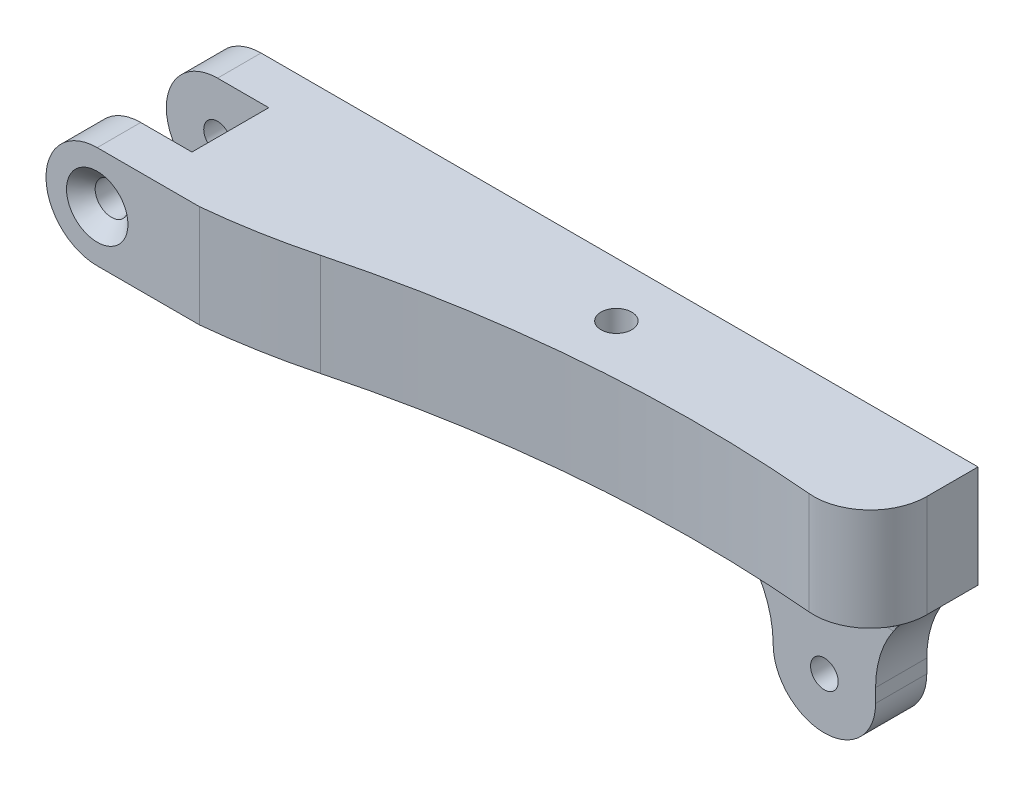
ISO-10303-21;
HEADER;
FILE_DESCRIPTION(('STEP AP214'),'2;1');
FILE_NAME('part.step','',(''),(''),'','','');
FILE_SCHEMA(('AUTOMOTIVE_DESIGN { 1 0 10303 214 1 1 1 1 }'));
ENDSEC;
DATA;
#1=APPLICATION_CONTEXT('core data for automotive mechanical design processes');
#2=APPLICATION_PROTOCOL_DEFINITION('international standard','automotive_design',2000,#1);
#3=PRODUCT_CONTEXT('',#1,'mechanical');
#4=PRODUCT('Part','Part','',(#3));
#5=PRODUCT_RELATED_PRODUCT_CATEGORY('part','',(#4));
#6=PRODUCT_DEFINITION_FORMATION('','',#4);
#7=PRODUCT_DEFINITION_CONTEXT('part definition',#1,'design');
#8=PRODUCT_DEFINITION('design','',#6,#7);
#9=PRODUCT_DEFINITION_SHAPE('','',#8);
#10=(LENGTH_UNIT() NAMED_UNIT(*) SI_UNIT(.MILLI.,.METRE.));
#11=(NAMED_UNIT(*) PLANE_ANGLE_UNIT() SI_UNIT($,.RADIAN.));
#12=(NAMED_UNIT(*) SI_UNIT($,.STERADIAN.) SOLID_ANGLE_UNIT());
#13=UNCERTAINTY_MEASURE_WITH_UNIT(LENGTH_MEASURE(1.E-05),#10,'distance_accuracy_value','');
#14=(GEOMETRIC_REPRESENTATION_CONTEXT(3) GLOBAL_UNCERTAINTY_ASSIGNED_CONTEXT((#13)) GLOBAL_UNIT_ASSIGNED_CONTEXT((#10,
#11,#12)) REPRESENTATION_CONTEXT('',''));
#15=CARTESIAN_POINT('',(0.,0.,0.));
#16=DIRECTION('',(0.,0.,1.));
#17=DIRECTION('',(1.,0.,0.));
#18=AXIS2_PLACEMENT_3D('',#15,#16,#17);
#19=CARTESIAN_POINT('',(0.,5.,16.));
#20=DIRECTION('',(0.,0.,-1.));
#21=DIRECTION('',(-1.,0.,0.));
#22=AXIS2_PLACEMENT_3D('',#19,#20,#21);
#23=CYLINDRICAL_SURFACE('',#22,1.6);
#24=CARTESIAN_POINT('',(0.,5.,11.75));
#25=DIRECTION('',(0.,0.,1.));
#26=DIRECTION('',(1.,0.,0.));
#27=AXIS2_PLACEMENT_3D('',#24,#25,#26);
#28=CIRCLE('',#27,1.6);
#29=CARTESIAN_POINT('',(1.6,5.,11.75));
#30=VERTEX_POINT('',#29);
#31=EDGE_CURVE('E270',#30,#30,#28,.T.);
#32=ORIENTED_EDGE('',*,*,#31,.F.);
#33=EDGE_LOOP('',(#32));
#34=FACE_BOUND('',#33,.T.);
#35=CARTESIAN_POINT('',(0.,5.,14.6));
#36=DIRECTION('',(0.,0.,1.));
#37=DIRECTION('',(1.,0.,0.));
#38=AXIS2_PLACEMENT_3D('',#35,#36,#37);
#39=CIRCLE('',#38,1.6);
#40=CARTESIAN_POINT('',(1.6,5.,14.6));
#41=VERTEX_POINT('',#40);
#42=EDGE_CURVE('E697',#41,#41,#39,.T.);
#43=ORIENTED_EDGE('',*,*,#42,.T.);
#44=EDGE_LOOP('',(#43));
#45=FACE_BOUND('',#44,.T.);
#46=ADVANCED_FACE('F42',(#34,#45),#23,.F.);
#47=CARTESIAN_POINT('',(0.,5.,16.));
#48=DIRECTION('',(0.,0.,-1.));
#49=DIRECTION('',(-1.,0.,0.));
#50=AXIS2_PLACEMENT_3D('',#47,#48,#49);
#51=CYLINDRICAL_SURFACE('',#50,5.);
#52=DIRECTION('',(0.,0.,-1.));
#53=VECTOR('',#52,1.);
#54=CARTESIAN_POINT('',(0.,10.,16.));
#55=LINE('',#54,#53);
#56=CARTESIAN_POINT('',(0.,10.,16.));
#57=VERTEX_POINT('',#56);
#58=CARTESIAN_POINT('',(0.,10.,11.75));
#59=VERTEX_POINT('',#58);
#60=EDGE_CURVE('E302',#57,#59,#55,.T.);
#61=ORIENTED_EDGE('',*,*,#60,.T.);
#62=CARTESIAN_POINT('',(0.,5.,11.75));
#63=DIRECTION('',(0.,0.,1.));
#64=DIRECTION('',(1.,0.,0.));
#65=AXIS2_PLACEMENT_3D('',#62,#63,#64);
#66=CIRCLE('',#65,5.);
#67=CARTESIAN_POINT('',(0.,0.,11.75));
#68=VERTEX_POINT('',#67);
#69=EDGE_CURVE('E271',#59,#68,#66,.T.);
#70=ORIENTED_EDGE('',*,*,#69,.T.);
#71=DIRECTION('',(0.,0.,-1.));
#72=VECTOR('',#71,1.);
#73=CARTESIAN_POINT('',(0.,0.,16.));
#74=LINE('',#73,#72);
#75=CARTESIAN_POINT('',(0.,0.,16.));
#76=VERTEX_POINT('',#75);
#77=EDGE_CURVE('E313',#76,#68,#74,.T.);
#78=ORIENTED_EDGE('',*,*,#77,.F.);
#79=CARTESIAN_POINT('',(0.,5.,16.));
#80=DIRECTION('',(0.,0.,1.));
#81=DIRECTION('',(1.,0.,0.));
#82=AXIS2_PLACEMENT_3D('',#79,#80,#81);
#83=CIRCLE('',#82,5.);
#84=EDGE_CURVE('E275',#57,#76,#83,.T.);
#85=ORIENTED_EDGE('',*,*,#84,.F.);
#86=EDGE_LOOP('',(#61,#70,#78,#85));
#87=FACE_BOUND('',#86,.T.);
#88=ADVANCED_FACE('F487',(#87),#51,.T.);
#89=CARTESIAN_POINT('',(0.,5.,16.));
#90=DIRECTION('',(0.,0.,1.));
#91=DIRECTION('',(1.,0.,0.));
#92=AXIS2_PLACEMENT_3D('',#89,#90,#91);
#93=PLANE('',#92);
#94=CARTESIAN_POINT('',(0.,5.,16.));
#95=DIRECTION('',(0.,0.,1.));
#96=DIRECTION('',(1.,0.,0.));
#97=AXIS2_PLACEMENT_3D('',#94,#95,#96);
#98=CIRCLE('',#97,3.);
#99=CARTESIAN_POINT('',(3.,5.,16.));
#100=VERTEX_POINT('',#99);
#101=EDGE_CURVE('E700',#100,#100,#98,.T.);
#102=ORIENTED_EDGE('',*,*,#101,.F.);
#103=EDGE_LOOP('',(#102));
#104=FACE_BOUND('',#103,.T.);
#105=DIRECTION('',(0.,1.,0.));
#106=VECTOR('',#105,1.);
#107=CARTESIAN_POINT('',(10.,0.,16.));
#108=LINE('',#107,#106);
#109=CARTESIAN_POINT('',(10.,0.,16.));
#110=VERTEX_POINT('',#109);
#111=CARTESIAN_POINT('',(10.,10.,16.));
#112=VERTEX_POINT('',#111);
#113=EDGE_CURVE('E215',#110,#112,#108,.T.);
#114=ORIENTED_EDGE('',*,*,#113,.T.);
#115=DIRECTION('',(-1.,0.,0.));
#116=VECTOR('',#115,1.);
#117=CARTESIAN_POINT('',(0.,10.,16.));
#118=LINE('',#117,#116);
#119=EDGE_CURVE('E284',#112,#57,#118,.T.);
#120=ORIENTED_EDGE('',*,*,#119,.T.);
#121=ORIENTED_EDGE('',*,*,#84,.T.);
#122=DIRECTION('',(1.,0.,0.));
#123=VECTOR('',#122,1.);
#124=CARTESIAN_POINT('',(0.,0.,16.));
#125=LINE('',#124,#123);
#126=EDGE_CURVE('E279',#76,#110,#125,.T.);
#127=ORIENTED_EDGE('',*,*,#126,.T.);
#128=EDGE_LOOP('',(#114,#120,#121,#127));
#129=FACE_BOUND('',#128,.T.);
#130=ADVANCED_FACE('F490',(#104,#129),#93,.T.);
#131=CARTESIAN_POINT('',(0.,5.,0.));
#132=DIRECTION('',(0.,0.,1.));
#133=DIRECTION('',(1.,0.,0.));
#134=AXIS2_PLACEMENT_3D('',#131,#132,#133);
#135=PLANE('',#134);
#136=CARTESIAN_POINT('',(60.,-9.99999999999999,0.));
#137=DIRECTION('',(0.,0.,1.));
#138=DIRECTION('',(1.,0.,0.));
#139=AXIS2_PLACEMENT_3D('',#136,#137,#138);
#140=CIRCLE('',#139,1.35);
#141=CARTESIAN_POINT('',(61.35,-9.99999999999999,0.));
#142=VERTEX_POINT('',#141);
#143=EDGE_CURVE('E206',#142,#142,#140,.T.);
#144=ORIENTED_EDGE('',*,*,#143,.T.);
#145=EDGE_LOOP('',(#144));
#146=FACE_BOUND('',#145,.T.);
#147=CARTESIAN_POINT('',(0.,5.,0.));
#148=DIRECTION('',(0.,0.,1.));
#149=DIRECTION('',(1.,0.,0.));
#150=AXIS2_PLACEMENT_3D('',#147,#148,#149);
#151=CIRCLE('',#150,5.);
#152=CARTESIAN_POINT('',(0.,10.,0.));
#153=VERTEX_POINT('',#152);
#154=CARTESIAN_POINT('',(0.,0.,0.));
#155=VERTEX_POINT('',#154);
#156=EDGE_CURVE('E274',#153,#155,#151,.T.);
#157=ORIENTED_EDGE('',*,*,#156,.F.);
#158=DIRECTION('',(-1.,0.,0.));
#159=VECTOR('',#158,1.);
#160=CARTESIAN_POINT('',(0.,10.,0.));
#161=LINE('',#160,#159);
#162=CARTESIAN_POINT('',(70.,10.,0.));
#163=VERTEX_POINT('',#162);
#164=EDGE_CURVE('E280',#163,#153,#161,.T.);
#165=ORIENTED_EDGE('',*,*,#164,.F.);
#166=DIRECTION('',(0.,1.,0.));
#167=VECTOR('',#166,1.);
#168=CARTESIAN_POINT('',(70.,0.,0.));
#169=LINE('',#168,#167);
#170=CARTESIAN_POINT('',(70.,0.,0.));
#171=VERTEX_POINT('',#170);
#172=EDGE_CURVE('E295',#171,#163,#169,.T.);
#173=ORIENTED_EDGE('',*,*,#172,.F.);
#174=CARTESIAN_POINT('',(75.,-8.66025403784439,0.));
#175=DIRECTION('',(0.,0.,1.));
#176=DIRECTION('',(1.,0.,0.));
#177=AXIS2_PLACEMENT_3D('',#174,#175,#176);
#178=CIRCLE('',#177,10.);
#179=CARTESIAN_POINT('',(65.,-8.66025403784439,0.));
#180=VERTEX_POINT('',#179);
#181=EDGE_CURVE('E332',#171,#180,#178,.T.);
#182=ORIENTED_EDGE('',*,*,#181,.T.);
#183=DIRECTION('',(0.,-1.,0.));
#184=VECTOR('',#183,1.);
#185=CARTESIAN_POINT('',(65.,-10.,0.));
#186=LINE('',#185,#184);
#187=CARTESIAN_POINT('',(65.,-10.,0.));
#188=VERTEX_POINT('',#187);
#189=EDGE_CURVE('E214',#180,#188,#186,.T.);
#190=ORIENTED_EDGE('',*,*,#189,.T.);
#191=CARTESIAN_POINT('',(60.,-9.99999999999999,0.));
#192=DIRECTION('',(0.,0.,-1.));
#193=DIRECTION('',(-1.,0.,0.));
#194=AXIS2_PLACEMENT_3D('',#191,#192,#193);
#195=CIRCLE('',#194,5.);
#196=CARTESIAN_POINT('',(55.,-9.99999999999999,0.));
#197=VERTEX_POINT('',#196);
#198=EDGE_CURVE('E225',#188,#197,#195,.T.);
#199=ORIENTED_EDGE('',*,*,#198,.T.);
#200=CARTESIAN_POINT('',(45.,-10.,0.));
#201=DIRECTION('',(0.,0.,1.));
#202=DIRECTION('',(1.,0.,0.));
#203=AXIS2_PLACEMENT_3D('',#200,#201,#202);
#204=CIRCLE('',#203,10.);
#205=CARTESIAN_POINT('',(45.,0.,0.));
#206=VERTEX_POINT('',#205);
#207=EDGE_CURVE('E348',#197,#206,#204,.T.);
#208=ORIENTED_EDGE('',*,*,#207,.T.);
#209=DIRECTION('',(1.,0.,0.));
#210=VECTOR('',#209,1.);
#211=CARTESIAN_POINT('',(0.,0.,0.));
#212=LINE('',#211,#210);
#213=EDGE_CURVE('E291',#155,#206,#212,.T.);
#214=ORIENTED_EDGE('',*,*,#213,.F.);
#215=EDGE_LOOP('',(#157,#165,#173,#182,#190,#199,#208,#214));
#216=FACE_BOUND('',#215,.T.);
#217=CARTESIAN_POINT('',(0.,5.,0.));
#218=DIRECTION('',(0.,0.,1.));
#219=DIRECTION('',(1.,0.,0.));
#220=AXIS2_PLACEMENT_3D('',#217,#218,#219);
#221=CIRCLE('',#220,1.35);
#222=CARTESIAN_POINT('',(1.35,5.,0.));
#223=VERTEX_POINT('',#222);
#224=EDGE_CURVE('E411',#223,#223,#221,.T.);
#225=ORIENTED_EDGE('',*,*,#224,.T.);
#226=EDGE_LOOP('',(#225));
#227=FACE_BOUND('',#226,.T.);
#228=ADVANCED_FACE('F425',(#146,#216,#227),#135,.F.);
#229=CARTESIAN_POINT('',(0.,5.,4.25));
#230=DIRECTION('',(0.,0.,-1.));
#231=DIRECTION('',(-1.,0.,0.));
#232=AXIS2_PLACEMENT_3D('',#229,#230,#231);
#233=CIRCLE('',#232,5.);
#234=CARTESIAN_POINT('',(0.,0.,4.25));
#235=VERTEX_POINT('',#234);
#236=CARTESIAN_POINT('',(0.,10.,4.25));
#237=VERTEX_POINT('',#236);
#238=EDGE_CURVE('E265',#235,#237,#233,.T.);
#239=ORIENTED_EDGE('',*,*,#238,.T.);
#240=EDGE_CURVE('E287',#237,#153,#55,.T.);
#241=ORIENTED_EDGE('',*,*,#240,.T.);
#242=ORIENTED_EDGE('',*,*,#156,.T.);
#243=EDGE_CURVE('E312',#235,#155,#74,.T.);
#244=ORIENTED_EDGE('',*,*,#243,.F.);
#245=EDGE_LOOP('',(#239,#241,#242,#244));
#246=FACE_BOUND('',#245,.T.);
#247=ADVANCED_FACE('F463',(#246),#51,.T.);
#248=CARTESIAN_POINT('',(0.,0.,16.));
#249=DIRECTION('',(0.,1.,0.));
#250=DIRECTION('',(0.,0.,1.));
#251=AXIS2_PLACEMENT_3D('',#248,#249,#250);
#252=PLANE('',#251);
#253=CARTESIAN_POINT('',(40.,0.,5.30992030128766));
#254=DIRECTION('',(0.,-1.,0.));
#255=DIRECTION('',(0.,0.,-1.));
#256=AXIS2_PLACEMENT_3D('',#253,#254,#255);
#257=CIRCLE('',#256,1.5);
#258=CARTESIAN_POINT('',(40.,0.,3.80992030128765));
#259=VERTEX_POINT('',#258);
#260=EDGE_CURVE('E704',#259,#259,#257,.T.);
#261=ORIENTED_EDGE('',*,*,#260,.F.);
#262=EDGE_LOOP('',(#261));
#263=FACE_BOUND('',#262,.T.);
#264=DIRECTION('',(0.,0.,-1.));
#265=VECTOR('',#264,1.);
#266=CARTESIAN_POINT('',(10.,0.,16.));
#267=LINE('',#266,#265);
#268=CARTESIAN_POINT('',(10.,0.,11.75));
#269=VERTEX_POINT('',#268);
#270=CARTESIAN_POINT('',(10.,0.,4.25));
#271=VERTEX_POINT('',#270);
#272=EDGE_CURVE('E380',#269,#271,#267,.T.);
#273=ORIENTED_EDGE('',*,*,#272,.T.);
#274=DIRECTION('',(-1.,0.,0.));
#275=VECTOR('',#274,1.);
#276=CARTESIAN_POINT('',(5.,0.,4.25));
#277=LINE('',#276,#275);
#278=EDGE_CURVE('E243',#271,#235,#277,.T.);
#279=ORIENTED_EDGE('',*,*,#278,.T.);
#280=ORIENTED_EDGE('',*,*,#243,.T.);
#281=ORIENTED_EDGE('',*,*,#213,.T.);
#282=DIRECTION('',(0.,0.,-1.));
#283=VECTOR('',#282,1.);
#284=CARTESIAN_POINT('',(45.,0.,16.));
#285=LINE('',#284,#283);
#286=CARTESIAN_POINT('',(45.,0.,8.));
#287=VERTEX_POINT('',#286);
#288=EDGE_CURVE('E325',#206,#287,#285,.F.);
#289=ORIENTED_EDGE('',*,*,#288,.T.);
#290=DIRECTION('',(1.,0.,0.));
#291=VECTOR('',#290,1.);
#292=CARTESIAN_POINT('',(65.,0.,8.));
#293=LINE('',#292,#291);
#294=CARTESIAN_POINT('',(69.1145597711353,0.,8.));
#295=VERTEX_POINT('',#294);
#296=EDGE_CURVE('E173',#287,#295,#293,.T.);
#297=ORIENTED_EDGE('',*,*,#296,.T.);
#298=CARTESIAN_POINT('',(64.4750621894396,0.,5.));
#299=DIRECTION('',(0.,-1.,0.));
#300=DIRECTION('',(0.,0.,-1.));
#301=AXIS2_PLACEMENT_3D('',#298,#299,#300);
#302=CIRCLE('',#301,5.52493781056044);
#303=CARTESIAN_POINT('',(63.9869057747983,0.,10.5033300033166));
#304=VERTEX_POINT('',#303);
#305=EDGE_CURVE('E165',#295,#304,#302,.T.);
#306=ORIENTED_EDGE('',*,*,#305,.T.);
#307=CARTESIAN_POINT('',(52.6158412781554,0.,138.697323848537));
#308=DIRECTION('',(0.,1.,0.));
#309=DIRECTION('',(0.,0.,1.));
#310=AXIS2_PLACEMENT_3D('',#307,#308,#309);
#311=CIRCLE('',#310,128.697323848537);
#312=CARTESIAN_POINT('',(20.,0.,14.2015084028226));
#313=VERTEX_POINT('',#312);
#314=EDGE_CURVE('E171',#304,#313,#311,.T.);
#315=ORIENTED_EDGE('',*,*,#314,.T.);
#316=CARTESIAN_POINT('',(3.53565069500815,0.,-48.6434930499183));
#317=DIRECTION('',(0.,-1.,0.));
#318=DIRECTION('',(0.,0.,1.));
#319=AXIS2_PLACEMENT_3D('',#316,#317,#318);
#320=CIRCLE('',#319,64.9659064866472);
#321=EDGE_CURVE('E192',#313,#110,#320,.T.);
#322=ORIENTED_EDGE('',*,*,#321,.T.);
#323=ORIENTED_EDGE('',*,*,#126,.F.);
#324=ORIENTED_EDGE('',*,*,#77,.T.);
#325=DIRECTION('',(1.,0.,0.));
#326=VECTOR('',#325,1.);
#327=CARTESIAN_POINT('',(5.,0.,11.75));
#328=LINE('',#327,#326);
#329=EDGE_CURVE('E247',#68,#269,#328,.T.);
#330=ORIENTED_EDGE('',*,*,#329,.T.);
#331=EDGE_LOOP('',(#273,#279,#280,#281,#289,#297,#306,#315,#322,#323,#324,#330));
#332=FACE_BOUND('',#331,.T.);
#333=ADVANCED_FACE('F168',(#263,#332),#252,.F.);
#334=CARTESIAN_POINT('',(70.,0.,16.));
#335=DIRECTION('',(-1.,0.,0.));
#336=DIRECTION('',(0.,0.,1.));
#337=AXIS2_PLACEMENT_3D('',#334,#335,#336);
#338=PLANE('',#337);
#339=DIRECTION('',(0.,0.,-1.));
#340=VECTOR('',#339,1.);
#341=CARTESIAN_POINT('',(70.,10.,16.));
#342=LINE('',#341,#340);
#343=CARTESIAN_POINT('',(70.,10.,5.));
#344=VERTEX_POINT('',#343);
#345=EDGE_CURVE('E306',#344,#163,#342,.T.);
#346=ORIENTED_EDGE('',*,*,#345,.F.);
#347=DIRECTION('',(0.,1.,0.));
#348=VECTOR('',#347,1.);
#349=CARTESIAN_POINT('',(70.,0.,5.));
#350=LINE('',#349,#348);
#351=CARTESIAN_POINT('',(70.,0.,5.));
#352=VERTEX_POINT('',#351);
#353=EDGE_CURVE('E211',#352,#344,#350,.T.);
#354=ORIENTED_EDGE('',*,*,#353,.F.);
#355=DIRECTION('',(0.,0.,-1.));
#356=VECTOR('',#355,1.);
#357=CARTESIAN_POINT('',(70.,0.,16.));
#358=LINE('',#357,#356);
#359=EDGE_CURVE('E309',#352,#171,#358,.T.);
#360=ORIENTED_EDGE('',*,*,#359,.T.);
#361=ORIENTED_EDGE('',*,*,#172,.T.);
#362=EDGE_LOOP('',(#346,#354,#360,#361));
#363=FACE_BOUND('',#362,.T.);
#364=ADVANCED_FACE('F519',(#363),#338,.F.);
#365=CARTESIAN_POINT('',(0.,10.,16.));
#366=DIRECTION('',(0.,-1.,0.));
#367=DIRECTION('',(0.,0.,-1.));
#368=AXIS2_PLACEMENT_3D('',#365,#366,#367);
#369=PLANE('',#368);
#370=CARTESIAN_POINT('',(40.,10.,5.30992030128766));
#371=DIRECTION('',(0.,-1.,0.));
#372=DIRECTION('',(0.,0.,-1.));
#373=AXIS2_PLACEMENT_3D('',#370,#371,#372);
#374=CIRCLE('',#373,1.5);
#375=CARTESIAN_POINT('',(40.,10.,3.80992030128765));
#376=VERTEX_POINT('',#375);
#377=EDGE_CURVE('E417',#376,#376,#374,.T.);
#378=ORIENTED_EDGE('',*,*,#377,.T.);
#379=EDGE_LOOP('',(#378));
#380=FACE_BOUND('',#379,.T.);
#381=CARTESIAN_POINT('',(52.6158412781554,10.,138.697323848537));
#382=DIRECTION('',(0.,1.,0.));
#383=DIRECTION('',(0.,0.,1.));
#384=AXIS2_PLACEMENT_3D('',#381,#382,#383);
#385=CIRCLE('',#384,128.697323848537);
#386=CARTESIAN_POINT('',(63.9869057747983,10.,10.5033300033166));
#387=VERTEX_POINT('',#386);
#388=CARTESIAN_POINT('',(20.,10.,14.2015084028226));
#389=VERTEX_POINT('',#388);
#390=EDGE_CURVE('E205',#387,#389,#385,.T.);
#391=ORIENTED_EDGE('',*,*,#390,.F.);
#392=CARTESIAN_POINT('',(64.4750621894396,10.,5.));
#393=DIRECTION('',(0.,-1.,0.));
#394=DIRECTION('',(0.,0.,-1.));
#395=AXIS2_PLACEMENT_3D('',#392,#393,#394);
#396=CIRCLE('',#395,5.52493781056044);
#397=EDGE_CURVE('E186',#344,#387,#396,.T.);
#398=ORIENTED_EDGE('',*,*,#397,.F.);
#399=ORIENTED_EDGE('',*,*,#345,.T.);
#400=ORIENTED_EDGE('',*,*,#164,.T.);
#401=ORIENTED_EDGE('',*,*,#240,.F.);
#402=DIRECTION('',(-1.,0.,0.));
#403=VECTOR('',#402,1.);
#404=CARTESIAN_POINT('',(5.,10.,4.25));
#405=LINE('',#404,#403);
#406=CARTESIAN_POINT('',(5.,10.,4.25));
#407=VERTEX_POINT('',#406);
#408=EDGE_CURVE('E255',#407,#237,#405,.T.);
#409=ORIENTED_EDGE('',*,*,#408,.F.);
#410=DIRECTION('',(0.,0.,-1.));
#411=VECTOR('',#410,1.);
#412=CARTESIAN_POINT('',(5.,10.,4.25));
#413=LINE('',#412,#411);
#414=CARTESIAN_POINT('',(5.,10.,11.75));
#415=VERTEX_POINT('',#414);
#416=EDGE_CURVE('E239',#415,#407,#413,.T.);
#417=ORIENTED_EDGE('',*,*,#416,.F.);
#418=DIRECTION('',(1.,0.,0.));
#419=VECTOR('',#418,1.);
#420=CARTESIAN_POINT('',(5.,10.,11.75));
#421=LINE('',#420,#419);
#422=EDGE_CURVE('E248',#59,#415,#421,.T.);
#423=ORIENTED_EDGE('',*,*,#422,.F.);
#424=ORIENTED_EDGE('',*,*,#60,.F.);
#425=ORIENTED_EDGE('',*,*,#119,.F.);
#426=CARTESIAN_POINT('',(3.53565069500815,10.,-48.6434930499183));
#427=DIRECTION('',(0.,-1.,0.));
#428=DIRECTION('',(0.,0.,1.));
#429=AXIS2_PLACEMENT_3D('',#426,#427,#428);
#430=CIRCLE('',#429,64.9659064866472);
#431=EDGE_CURVE('E180',#389,#112,#430,.T.);
#432=ORIENTED_EDGE('',*,*,#431,.F.);
#433=EDGE_LOOP('',(#391,#398,#399,#400,#401,#409,#417,#423,#424,#425,#432));
#434=FACE_BOUND('',#433,.T.);
#435=ADVANCED_FACE('F468',(#380,#434),#369,.F.);
#436=CARTESIAN_POINT('',(5.,0.,11.75));
#437=DIRECTION('',(0.,0.,1.));
#438=DIRECTION('',(1.,0.,0.));
#439=AXIS2_PLACEMENT_3D('',#436,#437,#438);
#440=PLANE('',#439);
#441=ORIENTED_EDGE('',*,*,#31,.T.);
#442=EDGE_LOOP('',(#441));
#443=FACE_BOUND('',#442,.T.);
#444=ORIENTED_EDGE('',*,*,#422,.T.);
#445=DIRECTION('',(0.,1.,0.));
#446=VECTOR('',#445,1.);
#447=CARTESIAN_POINT('',(5.,0.,11.75));
#448=LINE('',#447,#446);
#449=CARTESIAN_POINT('',(5.,5.00000000000002,11.75));
#450=VERTEX_POINT('',#449);
#451=EDGE_CURVE('E262',#450,#415,#448,.T.);
#452=ORIENTED_EDGE('',*,*,#451,.F.);
#453=DIRECTION('',(-0.707106781186546,0.707106781186549,0.));
#454=VECTOR('',#453,1.);
#455=CARTESIAN_POINT('',(7.50000000000001,2.5,11.75));
#456=LINE('',#455,#454);
#457=EDGE_CURVE('E11',#450,#269,#456,.F.);
#458=ORIENTED_EDGE('',*,*,#457,.T.);
#459=ORIENTED_EDGE('',*,*,#329,.F.);
#460=ORIENTED_EDGE('',*,*,#69,.F.);
#461=EDGE_LOOP('',(#444,#452,#458,#459,#460));
#462=FACE_BOUND('',#461,.T.);
#463=ADVANCED_FACE('F479',(#443,#462),#440,.F.);
#464=CARTESIAN_POINT('',(5.,0.,4.25));
#465=DIRECTION('',(0.,0.,-1.));
#466=DIRECTION('',(-1.,0.,0.));
#467=AXIS2_PLACEMENT_3D('',#464,#465,#466);
#468=PLANE('',#467);
#469=ORIENTED_EDGE('',*,*,#238,.F.);
#470=ORIENTED_EDGE('',*,*,#278,.F.);
#471=DIRECTION('',(0.707106781186546,-0.707106781186549,0.));
#472=VECTOR('',#471,1.);
#473=CARTESIAN_POINT('',(7.50000000000001,2.5,4.25));
#474=LINE('',#473,#472);
#475=CARTESIAN_POINT('',(5.,5.00000000000002,4.25));
#476=VERTEX_POINT('',#475);
#477=EDGE_CURVE('E52',#271,#476,#474,.F.);
#478=ORIENTED_EDGE('',*,*,#477,.T.);
#479=DIRECTION('',(0.,1.,0.));
#480=VECTOR('',#479,1.);
#481=CARTESIAN_POINT('',(5.,0.,4.25));
#482=LINE('',#481,#480);
#483=EDGE_CURVE('E251',#476,#407,#482,.T.);
#484=ORIENTED_EDGE('',*,*,#483,.T.);
#485=ORIENTED_EDGE('',*,*,#408,.T.);
#486=EDGE_LOOP('',(#469,#470,#478,#484,#485));
#487=FACE_BOUND('',#486,.T.);
#488=CARTESIAN_POINT('',(0.,5.,4.25));
#489=DIRECTION('',(0.,0.,-1.));
#490=DIRECTION('',(-1.,0.,0.));
#491=AXIS2_PLACEMENT_3D('',#488,#489,#490);
#492=CIRCLE('',#491,1.35);
#493=CARTESIAN_POINT('',(-1.35,5.,4.25));
#494=VERTEX_POINT('',#493);
#495=EDGE_CURVE('E404',#494,#494,#492,.T.);
#496=ORIENTED_EDGE('',*,*,#495,.T.);
#497=EDGE_LOOP('',(#496));
#498=FACE_BOUND('',#497,.T.);
#499=ADVANCED_FACE('F471',(#487,#498),#468,.F.);
#500=CARTESIAN_POINT('',(5.,0.,4.25));
#501=DIRECTION('',(1.,0.,0.));
#502=DIRECTION('',(0.,0.,-1.));
#503=AXIS2_PLACEMENT_3D('',#500,#501,#502);
#504=PLANE('',#503);
#505=ORIENTED_EDGE('',*,*,#483,.F.);
#506=DIRECTION('',(0.,0.,1.));
#507=VECTOR('',#506,1.);
#508=CARTESIAN_POINT('',(5.,5.00000000000002,4.25));
#509=LINE('',#508,#507);
#510=EDGE_CURVE('E59',#476,#450,#509,.T.);
#511=ORIENTED_EDGE('',*,*,#510,.T.);
#512=ORIENTED_EDGE('',*,*,#451,.T.);
#513=ORIENTED_EDGE('',*,*,#416,.T.);
#514=EDGE_LOOP('',(#505,#511,#512,#513));
#515=FACE_BOUND('',#514,.T.);
#516=ADVANCED_FACE('F482',(#515),#504,.F.);
#517=CARTESIAN_POINT('',(60.,-9.99999999999999,5.));
#518=DIRECTION('',(0.,0.,-1.));
#519=DIRECTION('',(-1.,0.,0.));
#520=AXIS2_PLACEMENT_3D('',#517,#518,#519);
#521=CYLINDRICAL_SURFACE('',#520,5.);
#522=ORIENTED_EDGE('',*,*,#198,.F.);
#523=DIRECTION('',(0.,0.,-1.));
#524=VECTOR('',#523,1.);
#525=CARTESIAN_POINT('',(65.,-10.,5.));
#526=LINE('',#525,#524);
#527=CARTESIAN_POINT('',(65.,-10.,5.));
#528=VERTEX_POINT('',#527);
#529=EDGE_CURVE('E229',#528,#188,#526,.T.);
#530=ORIENTED_EDGE('',*,*,#529,.F.);
#531=CARTESIAN_POINT('',(60.,-9.99999999999999,5.));
#532=DIRECTION('',(0.,0.,-1.));
#533=DIRECTION('',(-1.,0.,0.));
#534=AXIS2_PLACEMENT_3D('',#531,#532,#533);
#535=CIRCLE('',#534,5.);
#536=CARTESIAN_POINT('',(55.,-9.99999999999999,5.));
#537=VERTEX_POINT('',#536);
#538=EDGE_CURVE('E224',#528,#537,#535,.T.);
#539=ORIENTED_EDGE('',*,*,#538,.T.);
#540=DIRECTION('',(0.,0.,-1.));
#541=VECTOR('',#540,1.);
#542=CARTESIAN_POINT('',(55.,-9.99999999999999,5.));
#543=LINE('',#542,#541);
#544=EDGE_CURVE('E235',#537,#197,#543,.T.);
#545=ORIENTED_EDGE('',*,*,#544,.T.);
#546=EDGE_LOOP('',(#522,#530,#539,#545));
#547=FACE_BOUND('',#546,.T.);
#548=ADVANCED_FACE('F446',(#547),#521,.T.);
#549=CARTESIAN_POINT('',(65.,-10.,5.));
#550=DIRECTION('',(1.,0.,0.));
#551=DIRECTION('',(0.,0.,-1.));
#552=AXIS2_PLACEMENT_3D('',#549,#550,#551);
#553=PLANE('',#552);
#554=ORIENTED_EDGE('',*,*,#189,.F.);
#555=DIRECTION('',(0.,0.,-1.));
#556=VECTOR('',#555,1.);
#557=CARTESIAN_POINT('',(65.,-8.66025403784439,8.));
#558=LINE('',#557,#556);
#559=CARTESIAN_POINT('',(65.,-8.66025403784439,5.));
#560=VERTEX_POINT('',#559);
#561=EDGE_CURVE('E328',#180,#560,#558,.F.);
#562=ORIENTED_EDGE('',*,*,#561,.T.);
#563=DIRECTION('',(0.,-1.,0.));
#564=VECTOR('',#563,1.);
#565=CARTESIAN_POINT('',(65.,-10.,5.));
#566=LINE('',#565,#564);
#567=EDGE_CURVE('E221',#560,#528,#566,.T.);
#568=ORIENTED_EDGE('',*,*,#567,.T.);
#569=ORIENTED_EDGE('',*,*,#529,.T.);
#570=EDGE_LOOP('',(#554,#562,#568,#569));
#571=FACE_BOUND('',#570,.T.);
#572=ADVANCED_FACE('F367',(#571),#553,.T.);
#573=CARTESIAN_POINT('',(60.,-9.99999999999999,5.));
#574=DIRECTION('',(0.,0.,-1.));
#575=DIRECTION('',(-1.,0.,0.));
#576=AXIS2_PLACEMENT_3D('',#573,#574,#575);
#577=PLANE('',#576);
#578=CARTESIAN_POINT('',(60.,-9.99999999999999,5.));
#579=DIRECTION('',(0.,0.,1.));
#580=DIRECTION('',(1.,0.,0.));
#581=AXIS2_PLACEMENT_3D('',#578,#579,#580);
#582=CIRCLE('',#581,1.35);
#583=CARTESIAN_POINT('',(61.35,-9.99999999999999,5.));
#584=VERTEX_POINT('',#583);
#585=EDGE_CURVE('E403',#584,#584,#582,.T.);
#586=ORIENTED_EDGE('',*,*,#585,.F.);
#587=EDGE_LOOP('',(#586));
#588=FACE_BOUND('',#587,.T.);
#589=ORIENTED_EDGE('',*,*,#567,.F.);
#590=CARTESIAN_POINT('',(75.,-8.66025403784439,5.));
#591=DIRECTION('',(0.,0.,-1.));
#592=DIRECTION('',(-1.,0.,0.));
#593=AXIS2_PLACEMENT_3D('',#590,#591,#592);
#594=CIRCLE('',#593,10.);
#595=CARTESIAN_POINT('',(66.756122015273,-3.,5.));
#596=VERTEX_POINT('',#595);
#597=EDGE_CURVE('E335',#560,#596,#594,.T.);
#598=ORIENTED_EDGE('',*,*,#597,.T.);
#599=DIRECTION('',(1.,0.,0.));
#600=VECTOR('',#599,1.);
#601=CARTESIAN_POINT('',(55.,-3.,5.));
#602=LINE('',#601,#600);
#603=CARTESIAN_POINT('',(52.1414284285428,-3.,5.));
#604=VERTEX_POINT('',#603);
#605=EDGE_CURVE('E322',#596,#604,#602,.F.);
#606=ORIENTED_EDGE('',*,*,#605,.T.);
#607=CARTESIAN_POINT('',(45.,-10.,5.));
#608=DIRECTION('',(0.,0.,-1.));
#609=DIRECTION('',(-1.,0.,0.));
#610=AXIS2_PLACEMENT_3D('',#607,#608,#609);
#611=CIRCLE('',#610,10.);
#612=EDGE_CURVE('E399',#604,#537,#611,.T.);
#613=ORIENTED_EDGE('',*,*,#612,.T.);
#614=ORIENTED_EDGE('',*,*,#538,.F.);
#615=EDGE_LOOP('',(#589,#598,#606,#613,#614));
#616=FACE_BOUND('',#615,.T.);
#617=ADVANCED_FACE('F434',(#588,#616),#577,.F.);
#618=CARTESIAN_POINT('',(64.4750621894396,0.,5.));
#619=DIRECTION('',(0.,1.,0.));
#620=DIRECTION('',(0.,0.,1.));
#621=AXIS2_PLACEMENT_3D('',#618,#619,#620);
#622=CYLINDRICAL_SURFACE('',#621,5.52493781056044);
#623=ORIENTED_EDGE('',*,*,#397,.T.);
#624=DIRECTION('',(0.,1.,0.));
#625=VECTOR('',#624,1.);
#626=CARTESIAN_POINT('',(63.9869057747983,0.,10.5033300033166));
#627=LINE('',#626,#625);
#628=EDGE_CURVE('E183',#304,#387,#627,.T.);
#629=ORIENTED_EDGE('',*,*,#628,.F.);
#630=ORIENTED_EDGE('',*,*,#305,.F.);
#631=EDGE_CURVE('E179',#352,#295,#302,.T.);
#632=ORIENTED_EDGE('',*,*,#631,.F.);
#633=ORIENTED_EDGE('',*,*,#353,.T.);
#634=EDGE_LOOP('',(#623,#629,#630,#632,#633));
#635=FACE_BOUND('',#634,.T.);
#636=ADVANCED_FACE('F184',(#635),#622,.T.);
#637=CARTESIAN_POINT('',(3.53565069500815,0.,-48.6434930499183));
#638=DIRECTION('',(0.,1.,0.));
#639=DIRECTION('',(0.,0.,1.));
#640=AXIS2_PLACEMENT_3D('',#637,#638,#639);
#641=CYLINDRICAL_SURFACE('',#640,64.9659064866472);
#642=ORIENTED_EDGE('',*,*,#431,.T.);
#643=ORIENTED_EDGE('',*,*,#113,.F.);
#644=ORIENTED_EDGE('',*,*,#321,.F.);
#645=DIRECTION('',(0.,1.,0.));
#646=VECTOR('',#645,1.);
#647=CARTESIAN_POINT('',(20.,0.,14.2015084028226));
#648=LINE('',#647,#646);
#649=EDGE_CURVE('E191',#313,#389,#648,.T.);
#650=ORIENTED_EDGE('',*,*,#649,.T.);
#651=EDGE_LOOP('',(#642,#643,#644,#650));
#652=FACE_BOUND('',#651,.T.);
#653=ADVANCED_FACE('F493',(#652),#641,.T.);
#654=CARTESIAN_POINT('',(52.6158412781554,0.,138.697323848537));
#655=DIRECTION('',(0.,1.,0.));
#656=DIRECTION('',(0.,0.,1.));
#657=AXIS2_PLACEMENT_3D('',#654,#655,#656);
#658=CYLINDRICAL_SURFACE('',#657,128.697323848537);
#659=ORIENTED_EDGE('',*,*,#390,.T.);
#660=ORIENTED_EDGE('',*,*,#649,.F.);
#661=ORIENTED_EDGE('',*,*,#314,.F.);
#662=ORIENTED_EDGE('',*,*,#628,.T.);
#663=EDGE_LOOP('',(#659,#660,#661,#662));
#664=FACE_BOUND('',#663,.T.);
#665=ADVANCED_FACE('F194',(#664),#658,.F.);
#666=CARTESIAN_POINT('',(60.,-9.99999999999999,0.));
#667=DIRECTION('',(0.,0.,1.));
#668=DIRECTION('',(1.,0.,0.));
#669=AXIS2_PLACEMENT_3D('',#666,#667,#668);
#670=CYLINDRICAL_SURFACE('',#669,1.35);
#671=ORIENTED_EDGE('',*,*,#143,.F.);
#672=EDGE_LOOP('',(#671));
#673=FACE_BOUND('',#672,.T.);
#674=ORIENTED_EDGE('',*,*,#585,.T.);
#675=EDGE_LOOP('',(#674));
#676=FACE_BOUND('',#675,.T.);
#677=ADVANCED_FACE('F428',(#673,#676),#670,.F.);
#678=CARTESIAN_POINT('',(0.,-3.,8.));
#679=DIRECTION('',(-1.,0.,0.));
#680=DIRECTION('',(0.,0.,1.));
#681=AXIS2_PLACEMENT_3D('',#678,#679,#680);
#682=CYLINDRICAL_SURFACE('',#681,3.);
#683=ORIENTED_EDGE('',*,*,#296,.F.);
#684=CARTESIAN_POINT('',(52.1414284285428,-3.,5.));
#685=CARTESIAN_POINT('',(52.0240547312688,-2.88021538100886,5.00004042152425));
#686=CARTESIAN_POINT('',(51.9037419237788,-2.763536011845,5.00716843855755));
#687=CARTESIAN_POINT('',(51.6583855799034,-2.53718855503872,5.03371973907893));
#688=CARTESIAN_POINT('',(51.5333515513048,-2.4275074595444,5.05311943383891));
#689=CARTESIAN_POINT('',(51.2804094097203,-2.21646664373064,5.10212266369695));
#690=CARTESIAN_POINT('',(51.1525382041166,-2.11503979290833,5.13163092052532));
#691=CARTESIAN_POINT('',(50.8934364767732,-1.91954464733758,5.19940606221691));
#692=CARTESIAN_POINT('',(50.7622038178991,-1.82548119634421,5.23767864849035));
#693=CARTESIAN_POINT('',(50.4317711428192,-1.60040813991878,5.34232478772627));
#694=CARTESIAN_POINT('',(50.2308847345807,-1.47397844029082,5.41326165601367));
#695=CARTESIAN_POINT('',(49.8245134746683,-1.23761599756301,5.56813406964853));
#696=CARTESIAN_POINT('',(49.6190272963925,-1.1276880859955,5.65207340740845));
#697=CARTESIAN_POINT('',(49.2033531381742,-0.923339653895396,5.83066872310362));
#698=CARTESIAN_POINT('',(48.9931447261342,-0.829013313050524,5.92538434650125));
#699=CARTESIAN_POINT('',(48.5700776072328,-0.656190767597268,6.12282899338267));
#700=CARTESIAN_POINT('',(48.3572190569816,-0.577693632229798,6.22555754521247));
#701=CARTESIAN_POINT('',(47.8860876609366,-0.421695809798228,6.45863794415015));
#702=CARTESIAN_POINT('',(47.6273555977778,-0.347622722208538,6.5903680309688));
#703=CARTESIAN_POINT('',(47.1079224072916,-0.221032953371306,6.86002438350561));
#704=CARTESIAN_POINT('',(46.8472207261947,-0.168522583167181,6.99795245018198));
#705=CARTESIAN_POINT('',(46.064773560423,-0.0428623725772056,7.41681711767363));
#706=CARTESIAN_POINT('',(45.5406836394909,-0.000932570765212438,7.70385556518345));
#707=CARTESIAN_POINT('',(45.0116939890859,-5.13322406291276E-06,7.99359494497422));
#708=CARTESIAN_POINT('',(45.0058469325132,-5.34916825941021E-09,7.99679750986951));
#709=CARTESIAN_POINT('',(45.,0.,8.));
#710=B_SPLINE_CURVE_WITH_KNOTS('',3,(#684,#685,#686,#687,#688,#689,#690,#691,#692,#693,#694,
#695,#696,#697,#698,#699,#700,#701,#702,#703,#704,#705,#706,#707,#708,#709),.UNSPECIFIED.,.F.,
.F.,(4,2,2,2,2,2,2,2,2,2,2,2,4),(0.,0.5026812578775,1.00439918142319,1.50151265730874,
1.99895044094774,2.74102058336989,3.48330757333029,4.22992365575313,4.9764958242559,
5.87440692538572,6.77258064294596,8.56196658141677,8.58196658733393),.UNSPECIFIED.);
#711=EDGE_CURVE('E391',#287,#604,#710,.F.);
#712=ORIENTED_EDGE('',*,*,#711,.T.);
#713=ORIENTED_EDGE('',*,*,#605,.F.);
#714=CARTESIAN_POINT('',(65.,-8.09281057690846,0.622055484064585));
#715=CARTESIAN_POINT('',(65.,-2.84581875630254,2.08476657195511));
#716=CARTESIAN_POINT('',(69.5762851294594,0.,2.87809935982476));
#717=CARTESIAN_POINT('',(65.,-8.15258375704917,0.836506602065565));
#718=CARTESIAN_POINT('',(65.,-2.85430990113456,2.22127570536311));
#719=CARTESIAN_POINT('',(69.6131413086382,0.,2.96665549468669));
#720=CARTESIAN_POINT('',(65.,-8.20710960059645,1.05238584918213));
#721=CARTESIAN_POINT('',(65.,-2.86100107385349,2.3597090206276));
#722=CARTESIAN_POINT('',(69.6487380929285,0.,3.05878518628632));
#723=CARTESIAN_POINT('',(65.,-8.30618008441692,1.48636007355444));
#724=CARTESIAN_POINT('',(65.,-2.87159987172761,2.64033469934151));
#725=CARTESIAN_POINT('',(69.7163513400326,0.,3.24956827083914));
#726=CARTESIAN_POINT('',(65.,-8.35072768740989,1.7044543729626));
#727=CARTESIAN_POINT('',(65.,-2.87550097899647,2.78250269005378));
#728=CARTESIAN_POINT('',(69.7483688641754,0.,3.34821971606857));
#729=CARTESIAN_POINT('',(65.,-8.43035124762067,2.14213295544802));
#730=CARTESIAN_POINT('',(65.,-2.88131091965947,3.07002933494991));
#731=CARTESIAN_POINT('',(69.8077562662067,0.,3.55137719759233));
#732=CARTESIAN_POINT('',(65.,-8.46543639516837,2.36171557890953));
#733=CARTESIAN_POINT('',(65.,-2.88321695162495,3.21534872796931));
#734=CARTESIAN_POINT('',(69.8351306440502,0.,3.65587743328235));
#735=CARTESIAN_POINT('',(65.,-8.5266568396024,2.80213955006493));
#736=CARTESIAN_POINT('',(65.,-2.88577728500391,3.5087742115819));
#737=CARTESIAN_POINT('',(69.8843023037383,0.,3.8699066931792));
#738=CARTESIAN_POINT('',(65.,-8.55279132507775,3.0229810100331));
#739=CARTESIAN_POINT('',(65.,-2.88642896895613,3.6568314657693));
#740=CARTESIAN_POINT('',(69.9060990799072,0.,3.97943617228557));
#741=CARTESIAN_POINT('',(65.,-8.59697662105299,3.47047181389398));
#742=CARTESIAN_POINT('',(65.,-2.88711659748483,3.95842610978478));
#743=CARTESIAN_POINT('',(69.9437039335905,0.,4.20486475278039));
#744=CARTESIAN_POINT('',(65.,-8.61483286641243,3.69714027792702));
#745=CARTESIAN_POINT('',(65.,-2.88713742222034,4.11194371651348));
#746=CARTESIAN_POINT('',(69.9593666433226,0.,4.32085163568527));
#747=CARTESIAN_POINT('',(65.,-8.64187428633173,4.1510169400397));
#748=CARTESIAN_POINT('',(65.,-2.8870252220244,4.42044048817988));
#749=CARTESIAN_POINT('',(69.983345606188,0.,4.55542101821921));
#750=CARTESIAN_POINT('',(65.,-8.65105845022297,4.3782251979358));
#751=CARTESIAN_POINT('',(65.,-2.88689208373288,4.57534561115888));
#752=CARTESIAN_POINT('',(69.9916610030376,0.,4.67400381873641));
#753=CARTESIAN_POINT('',(65.,-8.66091035257806,4.83292771658044));
#754=CARTESIAN_POINT('',(65.,-2.886745276043,4.88581683066042));
#755=CARTESIAN_POINT('',(70.0005880131632,0.,4.91219098826907));
#756=CARTESIAN_POINT('',(65.,-8.66157425401687,5.06042206004709));
#757=CARTESIAN_POINT('',(65.,-2.88673173379995,5.04130354190541));
#758=CARTESIAN_POINT('',(70.0011961555435,0.,5.03179579327501));
#759=CARTESIAN_POINT('',(65.,-8.65438749406037,5.51525258238395));
#760=CARTESIAN_POINT('',(65.,-2.88684446461123,5.35196630701819));
#761=CARTESIAN_POINT('',(69.9946739495825,0.,5.27028464826784));
#762=CARTESIAN_POINT('',(65.,-8.64653772954181,5.74258877539031));
#763=CARTESIAN_POINT('',(65.,-2.88697066350045,5.5070623647563));
#764=CARTESIAN_POINT('',(69.9875444163707,0.,5.38916877284861));
#765=CARTESIAN_POINT('',(65.,-8.62177826128362,6.20451003423178));
#766=CARTESIAN_POINT('',(65.,-2.88713075936851,5.82133097467755));
#767=CARTESIAN_POINT('',(69.9654854845733,0.,5.62859218716909));
#768=CARTESIAN_POINT('',(65.,-8.6045701139285,6.43907926093833));
#769=CARTESIAN_POINT('',(65.,-2.88716141304474,5.98038522127996));
#770=CARTESIAN_POINT('',(69.9502995784352,0.,5.74905071409898));
#771=CARTESIAN_POINT('',(65.,-8.56060865113416,6.90732861204157));
#772=CARTESIAN_POINT('',(65.,-2.88660125314393,6.29635214070005));
#773=CARTESIAN_POINT('',(69.9126602345147,0.,5.98581931884712));
#774=CARTESIAN_POINT('',(65.,-8.53385526050132,7.14100872941955));
#775=CARTESIAN_POINT('',(65.,-2.88601134404694,6.45319174116888));
#776=CARTESIAN_POINT('',(69.8902067394814,0.,6.10212936397735));
#777=CARTESIAN_POINT('',(65.,-8.47036223927731,7.60703728489985));
#778=CARTESIAN_POINT('',(65.,-2.88347822518096,6.76394113793943));
#779=CARTESIAN_POINT('',(69.8389858844459,0.,6.32921573941785));
#780=CARTESIAN_POINT('',(65.,-8.43362173541474,7.83938560473509));
#781=CARTESIAN_POINT('',(65.,-2.88153770476468,6.91779165002031));
#782=CARTESIAN_POINT('',(69.8102179723546,0.,6.4399915848155));
#783=CARTESIAN_POINT('',(65.,-8.34961079589169,8.30217658771052));
#784=CARTESIAN_POINT('',(65.,-2.87543164263958,7.22185806142663));
#785=CARTESIAN_POINT('',(69.7475139998727,0.,6.65490944551878));
#786=CARTESIAN_POINT('',(65.,-8.30234057768877,8.53261929010323));
#787=CARTESIAN_POINT('',(65.,-2.87127173513091,7.3720309500938));
#788=CARTESIAN_POINT('',(69.7135780462159,0.,6.75905159776502));
#789=CARTESIAN_POINT('',(65.,-8.19727403466529,8.988251748832));
#790=CARTESIAN_POINT('',(65.,-2.85985712228651,7.66642755914076));
#791=CARTESIAN_POINT('',(69.642198421925,0.,6.95876460075351));
#792=CARTESIAN_POINT('',(65.,-8.13960800552168,9.21347141055153));
#793=CARTESIAN_POINT('',(65.,-2.85264808855499,7.81067042542822));
#794=CARTESIAN_POINT('',(69.6048006846869,0.,7.05442183229673));
#795=CARTESIAN_POINT('',(65.,-8.01275302339909,9.66069376785665));
#796=CARTESIAN_POINT('',(65.,-2.83423903201968,8.09458567847939));
#797=CARTESIAN_POINT('',(69.5273656505369,0.,7.23810339685733));
#798=CARTESIAN_POINT('',(65.,-7.94356231283433,9.88269596713706));
#799=CARTESIAN_POINT('',(65.,-2.82304986220751,8.23424609244771));
#800=CARTESIAN_POINT('',(69.4873279515779,0.,7.32612656251357));
#801=CARTESIAN_POINT('',(65.,-7.79311079716371,10.3223774962249));
#802=CARTESIAN_POINT('',(65.,-2.79584684121123,8.50842899422225));
#803=CARTESIAN_POINT('',(69.4058022510526,0.,7.49428694998155));
#804=CARTESIAN_POINT('',(65.,-7.71186039979118,10.5400603718365));
#805=CARTESIAN_POINT('',(65.,-2.77985094102063,8.64295696573326));
#806=CARTESIAN_POINT('',(69.3643155234022,0.,7.57443087355022));
#807=CARTESIAN_POINT('',(65.,-7.53668950511099,10.9702632301797));
#808=CARTESIAN_POINT('',(65.,-2.74228828235851,8.90658116017026));
#809=CARTESIAN_POINT('',(69.2809081278357,0.,7.72696529549259));
#810=CARTESIAN_POINT('',(65.,-7.44276990387594,11.1827835767953));
#811=CARTESIAN_POINT('',(65.,-2.72073702408814,9.03568986864087));
#812=CARTESIAN_POINT('',(69.2389874908028,0.,7.79935634156596));
#813=CARTESIAN_POINT('',(65.,-7.2305774324125,11.6248607742709));
#814=CARTESIAN_POINT('',(65.,-2.66870128712787,9.30209325258503));
#815=CARTESIAN_POINT('',(69.1509857691296,0.,7.9442562281543));
#816=CARTESIAN_POINT('',(65.,-7.11075733258299,11.8536797650244));
#817=CARTESIAN_POINT('',(65.,-2.63750075659332,9.43876888236091));
#818=CARTESIAN_POINT('',(69.1049611634539,0.,8.01588068855293));
#819=CARTESIAN_POINT('',(65.,-6.85447082788326,12.30166814696));
#820=CARTESIAN_POINT('',(65.,-2.56682794245145,9.70422275488434));
#821=CARTESIAN_POINT('',(69.0145942317705,0.,8.1502596021179));
#822=CARTESIAN_POINT('',(65.,-6.71801297441901,12.5208424171182));
#823=CARTESIAN_POINT('',(65.,-2.52737926911997,9.83304228719498));
#824=CARTESIAN_POINT('',(68.9702510567847,0.,8.21301857642426));
#825=CARTESIAN_POINT('',(65.,-6.4265358963696,12.9501491543244));
#826=CARTESIAN_POINT('',(65.,-2.43929515360775,10.0835814306478));
#827=CARTESIAN_POINT('',(68.8836011026896,0.,8.33093924539704));
#828=CARTESIAN_POINT('',(65.,-6.27132536441161,13.1601523760875));
#829=CARTESIAN_POINT('',(65.,-2.39057651071158,10.2052536029258));
#830=CARTESIAN_POINT('',(68.8413227986958,0.,8.38600766588876));
#831=CARTESIAN_POINT('',(65.,-5.94354733350373,13.566580303277));
#832=CARTESIAN_POINT('',(65.,-2.28408976572155,10.4392635629304));
#833=CARTESIAN_POINT('',(68.7599460206282,0.,8.48839783083068));
#834=CARTESIAN_POINT('',(65.,-5.77095724648203,13.7629867630857));
#835=CARTESIAN_POINT('',(65.,-2.22632108165978,10.5516375299632));
#836=CARTESIAN_POINT('',(68.7208518073639,0.,8.53570927825104));
#837=CARTESIAN_POINT('',(65.,-5.58986153578306,13.9513739692089));
#838=CARTESIAN_POINT('',(65.,-2.16392292016132,10.6589868062677));
#839=CARTESIAN_POINT('',(68.683707844927,0.,8.57941888539282));
#840=(BOUNDED_SURFACE() B_SPLINE_SURFACE(3,2,((#714,#715,#716),(#717,#718,#719),(#720,#721,
#722),(#723,#724,#725),(#726,#727,#728),(#729,#730,#731),(#732,#733,#734),(#735,#736,#737),
(#738,#739,#740),(#741,#742,#743),(#744,#745,#746),(#747,#748,#749),(#750,#751,#752),(#753,#754,
#755),(#756,#757,#758),(#759,#760,#761),(#762,#763,#764),(#765,#766,#767),(#768,#769,#770),
(#771,#772,#773),(#774,#775,#776),(#777,#778,#779),(#780,#781,#782),(#783,#784,#785),(#786,#787,
#788),(#789,#790,#791),(#792,#793,#794),(#795,#796,#797),(#798,#799,#800),(#801,#802,#803),
(#804,#805,#806),(#807,#808,#809),(#810,#811,#812),(#813,#814,#815),(#816,#817,#818),(#819,#820,
#821),(#822,#823,#824),(#825,#826,#827),(#828,#829,#830),(#831,#832,#833),(#834,#835,#836),
(#837,#838,#839)),.UNSPECIFIED.,.F.,.F.,.F.) B_SPLINE_SURFACE_WITH_KNOTS((4,2,2,2,2,2,2,2,2,2,2,
2,2,2,2,2,2,2,2,2,4),(3,3),(0.,0.667761756883254,1.33532497964313,2.00223748309292,
2.6692104286608,3.3511507774248,4.03317059161825,4.71549753664686,5.39775260855428,
6.10316274610315,6.80857844071436,7.51405583659999,8.21951866445656,8.91668698887563,
9.61396173332497,10.3106381784883,11.0072653746467,11.7814590837326,12.5552565400965,
13.3377473507834,14.1212686167883),(0.,1.),
.UNSPECIFIED.) GEOMETRIC_REPRESENTATION_ITEM() RATIONAL_B_SPLINE_SURFACE(((1.,0.87817181890962,
1.),(1.,0.877122644922716,1.),(1.,0.876107330002087,1.),(1.,0.874175806152247,1.),(1.,
0.873259567847305,1.),(1.,0.871557754093739,1.),(1.,0.87077205214972,1.),(1.,0.869359180033467,
1.),(1.,0.868732024235382,1.),(1.,0.867649183598143,1.),(1.,0.867197662532581,1.),(1.,
0.866506111198322,1.),(1.,0.866266105580445,1.),(1.,0.866008439167183,1.),(1.,0.865990878547987,
1.),(1.,0.866179144713829,1.),(1.,0.86638494796848,1.),(1.,0.867021239267859,1.),(1.,
0.867459115837342,1.),(1.,0.868543193695814,1.),(1.,0.869189396625911,1.),(1.,0.870661383626572,
1.),(1.,0.871487183399789,1.),(1.,0.873284091804279,1.),(1.,0.874255197434588,1.),(1.,
0.876293960217614,1.),(1.,0.87736034791722,1.),(1.,0.879564057536066,1.),(1.,0.880701390258291,
1.),(1.,0.883012583069416,1.),(1.,0.884186410978499,1.),(1.,0.886541584755348,1.),(1.,
0.887722930085793,1.),(1.,0.890197959838369,1.),(1.,0.891489506560309,1.),(1.,0.894020073494774,
1.),(1.,0.895259120253407,1.),(1.,0.897675564612889,1.),(1.,0.898852113216575,1.),(1.,
0.901112641458189,1.),(1.,0.902196497152479,1.),(1.,0.903224561088574,1.))) REPRESENTATION_ITEM('') SURFACE());
#841=CARTESIAN_POINT('',(66.756122015273,-3.,5.));
#842=CARTESIAN_POINT('',(66.8282849234424,-2.89484544211639,5.00001245795324));
#843=CARTESIAN_POINT('',(66.9024652845906,-2.79116718123306,5.00552655279301));
#844=CARTESIAN_POINT('',(67.0540940535802,-2.58746212193041,5.02673531319783));
#845=CARTESIAN_POINT('',(67.131538835596,-2.4874314910543,5.04241894814708));
#846=CARTESIAN_POINT('',(67.2892324389216,-2.29131169018427,5.0831847578677));
#847=CARTESIAN_POINT('',(67.36948611439,-2.19523003751449,5.10828401320114));
#848=CARTESIAN_POINT('',(67.531963569043,-2.00748730393614,5.1672269214265));
#849=CARTESIAN_POINT('',(67.6141878654186,-1.9158274029644,5.20107289321474));
#850=CARTESIAN_POINT('',(67.7801030942973,-1.7368175535206,5.27715887274494));
#851=CARTESIAN_POINT('',(67.8637981183528,-1.64948362222485,5.31942753091443));
#852=CARTESIAN_POINT('',(68.0314985935385,-1.47952334179863,5.4120433581443));
#853=CARTESIAN_POINT('',(68.1155040512849,-1.39689709362428,5.46239070036352));
#854=CARTESIAN_POINT('',(68.2825802344986,-1.23652859427351,5.57110374484979));
#855=CARTESIAN_POINT('',(68.3656525560339,-1.15877642304087,5.62945233565045));
#856=CARTESIAN_POINT('',(68.5295883123626,-1.00801163174974,5.75465271553119));
#857=CARTESIAN_POINT('',(68.610453067988,-0.9349961399705,5.82149927836216));
#858=CARTESIAN_POINT('',(68.7595932122388,-0.801257586433149,5.95705774500564));
#859=CARTESIAN_POINT('',(68.8282940677207,-0.740052215964129,6.0248193938618));
#860=CARTESIAN_POINT('',(68.9601143994376,-0.62162349078847,6.16913964917145));
#861=CARTESIAN_POINT('',(69.0232249637361,-0.564406524188728,6.24571186995405));
#862=CARTESIAN_POINT('',(69.1408526913183,-0.453943403966305,6.41016411904237));
#863=CARTESIAN_POINT('',(69.1952355308409,-0.400764942473212,6.49818890145748));
#864=CARTESIAN_POINT('',(69.2876035939895,-0.301074821814057,6.68587439740479));
#865=CARTESIAN_POINT('',(69.325668484507,-0.254531530337716,6.78547548935344));
#866=CARTESIAN_POINT('',(69.3663821830263,-0.187818838096972,6.95299048097397));
#867=CARTESIAN_POINT('',(69.3771039738055,-0.164540145102556,7.01767256495905));
#868=CARTESIAN_POINT('',(69.3877399862712,-0.12233468400101,7.14924236655551));
#869=CARTESIAN_POINT('',(69.387675328833,-0.103399483769208,7.21612551738683));
#870=CARTESIAN_POINT('',(69.3762345357372,-0.0704205679053744,7.35012861526698));
#871=CARTESIAN_POINT('',(69.3648564438718,-0.056377698774198,7.41724860126704));
#872=CARTESIAN_POINT('',(69.3317099540583,-0.0331788684258864,7.54995976373375));
#873=CARTESIAN_POINT('',(69.3099021221146,-0.0240417360377151,7.61554413872059));
#874=CARTESIAN_POINT('',(69.2610920072948,-0.0111315096750548,7.73568632904145));
#875=CARTESIAN_POINT('',(69.235071221979,-0.00683316370285528,7.79060198842425));
#876=CARTESIAN_POINT('',(69.1781460438832,-0.00128177864596399,7.89744639059683));
#877=CARTESIAN_POINT('',(69.1472834689293,-4.04440138133682E-06,7.94939594245446));
#878=CARTESIAN_POINT('',(69.1145597711353,0.,7.9999999999999));
#879=B_SPLINE_CURVE_WITH_KNOTS('',3,(#841,#842,#843,#844,#845,#846,#847,#848,#849,#850,#851,
#852,#853,#854,#855,#856,#857,#858,#859,#860,#861,#862,#863,#864,#865,#866,#867,#868,#869,#870,
#871,#872,#873,#874,#875,#876,#877,#878),.UNSPECIFIED.,.F.,.F.,(4,2,2,2,2,2,2,2,2,2,2,2,2,2,2,2,
2,2,4),(0.,0.382351067664695,0.764288102005488,1.14692137263657,1.5296561898045,
1.91371584419401,2.29778373163332,2.68104270220801,3.0640670987317,3.40645650915748,
3.74938227964822,4.09716345557606,4.443226816026,4.65107768780707,4.85852157290944,
5.06600133340772,5.27427183534332,5.45667618136994,5.63758403523372),.UNSPECIFIED.);
#880=EDGE_CURVE('E339',#596,#295,#879,.T.);
#881=ORIENTED_EDGE('',*,*,#880,.T.);
#882=EDGE_LOOP('',(#683,#712,#713,#881));
#883=FACE_BOUND('',#882,.T.);
#884=ADVANCED_FACE('F350',(#883),#682,.F.);
#885=CARTESIAN_POINT('',(75.,-8.66025403784439,16.));
#886=DIRECTION('',(0.,0.,1.));
#887=DIRECTION('',(1.,0.,0.));
#888=AXIS2_PLACEMENT_3D('',#885,#886,#887);
#889=CYLINDRICAL_SURFACE('',#888,10.);
#890=ORIENTED_EDGE('',*,*,#181,.F.);
#891=ORIENTED_EDGE('',*,*,#359,.F.);
#892=CARTESIAN_POINT('',(75.,-8.66025403784439,5.));
#893=DIRECTION('',(0.,0.,-1.));
#894=DIRECTION('',(0.,1.,0.));
#895=AXIS2_PLACEMENT_3D('',#892,#893,#894);
#896=CIRCLE('',#895,10.);
#897=EDGE_CURVE('E401',#596,#352,#896,.T.);
#898=ORIENTED_EDGE('',*,*,#897,.F.);
#899=ORIENTED_EDGE('',*,*,#597,.F.);
#900=ORIENTED_EDGE('',*,*,#561,.F.);
#901=EDGE_LOOP('',(#890,#891,#898,#899,#900));
#902=FACE_BOUND('',#901,.T.);
#903=ADVANCED_FACE('F360',(#902),#889,.F.);
#904=ORIENTED_EDGE('',*,*,#880,.F.);
#905=ORIENTED_EDGE('',*,*,#897,.T.);
#906=ORIENTED_EDGE('',*,*,#631,.T.);
#907=EDGE_LOOP('',(#904,#905,#906));
#908=FACE_BOUND('',#907,.T.);
#909=ADVANCED_FACE('F353',(#908),#840,.F.);
#910=CARTESIAN_POINT('',(45.,-10.,5.));
#911=DIRECTION('',(0.,0.,-1.));
#912=DIRECTION('',(-1.,0.,0.));
#913=AXIS2_PLACEMENT_3D('',#910,#911,#912);
#914=CYLINDRICAL_SURFACE('',#913,10.);
#915=ORIENTED_EDGE('',*,*,#711,.F.);
#916=ORIENTED_EDGE('',*,*,#288,.F.);
#917=ORIENTED_EDGE('',*,*,#207,.F.);
#918=ORIENTED_EDGE('',*,*,#544,.F.);
#919=ORIENTED_EDGE('',*,*,#612,.F.);
#920=EDGE_LOOP('',(#915,#916,#917,#918,#919));
#921=FACE_BOUND('',#920,.T.);
#922=ADVANCED_FACE('F359',(#921),#914,.F.);
#923=CARTESIAN_POINT('',(0.,5.,11.6039105243401));
#924=DIRECTION('',(0.,0.,-1.));
#925=DIRECTION('',(-1.,0.,0.));
#926=AXIS2_PLACEMENT_3D('',#923,#924,#925);
#927=CYLINDRICAL_SURFACE('',#926,1.35);
#928=ORIENTED_EDGE('',*,*,#495,.F.);
#929=EDGE_LOOP('',(#928));
#930=FACE_BOUND('',#929,.T.);
#931=ORIENTED_EDGE('',*,*,#224,.F.);
#932=EDGE_LOOP('',(#931));
#933=FACE_BOUND('',#932,.T.);
#934=ADVANCED_FACE('F389',(#930,#933),#927,.F.);
#935=CARTESIAN_POINT('',(40.,10.,5.30992030128766));
#936=DIRECTION('',(0.,-1.,0.));
#937=DIRECTION('',(0.,0.,-1.));
#938=AXIS2_PLACEMENT_3D('',#935,#936,#937);
#939=CYLINDRICAL_SURFACE('',#938,1.5);
#940=ORIENTED_EDGE('',*,*,#377,.F.);
#941=EDGE_LOOP('',(#940));
#942=FACE_BOUND('',#941,.T.);
#943=ORIENTED_EDGE('',*,*,#260,.T.);
#944=EDGE_LOOP('',(#943));
#945=FACE_BOUND('',#944,.T.);
#946=ADVANCED_FACE('F634',(#942,#945),#939,.F.);
#947=CARTESIAN_POINT('',(0.,5.,13.));
#948=DIRECTION('',(0.,0.,1.));
#949=DIRECTION('',(1.,0.,0.));
#950=AXIS2_PLACEMENT_3D('',#947,#948,#949);
#951=CONICAL_SURFACE('',#950,0.,0.785398163397449);
#952=ORIENTED_EDGE('',*,*,#42,.F.);
#953=EDGE_LOOP('',(#952));
#954=FACE_BOUND('',#953,.T.);
#955=ORIENTED_EDGE('',*,*,#101,.T.);
#956=EDGE_LOOP('',(#955));
#957=FACE_BOUND('',#956,.T.);
#958=ADVANCED_FACE('F644',(#954,#957),#951,.F.);
#959=CARTESIAN_POINT('',(10.,0.,16.));
#960=DIRECTION('',(0.707106781186549,0.707106781186546,0.));
#961=DIRECTION('',(0.,0.,-1.));
#962=AXIS2_PLACEMENT_3D('',#959,#960,#961);
#963=PLANE('',#962);
#964=ORIENTED_EDGE('',*,*,#457,.F.);
#965=ORIENTED_EDGE('',*,*,#510,.F.);
#966=ORIENTED_EDGE('',*,*,#477,.F.);
#967=ORIENTED_EDGE('',*,*,#272,.F.);
#968=EDGE_LOOP('',(#964,#965,#966,#967));
#969=FACE_BOUND('',#968,.T.);
#970=ADVANCED_FACE('F45',(#969),#963,.F.);
#971=CLOSED_SHELL('',(#46,#88,#130,#228,#247,#333,#364,#435,#463,#499,#516,#548,#572,#617,#636,
#653,#665,#677,#884,#903,#909,#922,#934,#946,#958,#970));
#972=MANIFOLD_SOLID_BREP('B2',#971);
#973=ADVANCED_BREP_SHAPE_REPRESENTATION('',(#18,#972),#14);
#974=SHAPE_DEFINITION_REPRESENTATION(#9,#973);
ENDSEC;
END-ISO-10303-21;
